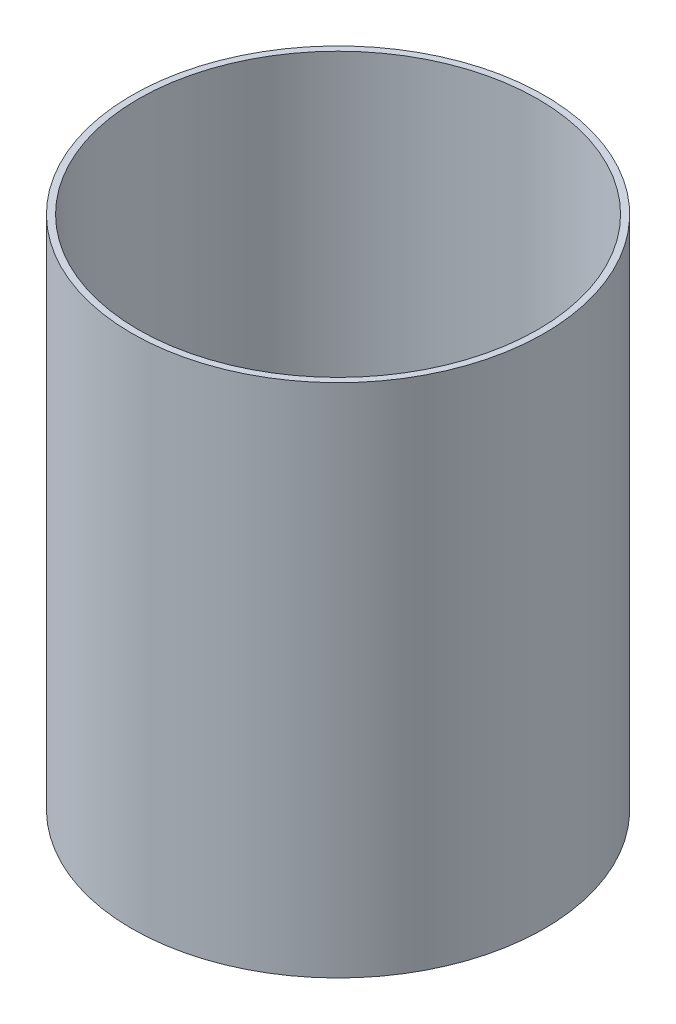
ISO-10303-21;
HEADER;
FILE_DESCRIPTION(('STEP AP214'),'2;1');
FILE_NAME('part.step','',(''),(''),'','','');
FILE_SCHEMA(('AUTOMOTIVE_DESIGN { 1 0 10303 214 1 1 1 1 }'));
ENDSEC;
DATA;
#1=APPLICATION_CONTEXT('core data for automotive mechanical design processes');
#2=APPLICATION_PROTOCOL_DEFINITION('international standard','automotive_design',2000,#1);
#3=PRODUCT_CONTEXT('',#1,'mechanical');
#4=PRODUCT('Part','Part','',(#3));
#5=PRODUCT_RELATED_PRODUCT_CATEGORY('part','',(#4));
#6=PRODUCT_DEFINITION_FORMATION('','',#4);
#7=PRODUCT_DEFINITION_CONTEXT('part definition',#1,'design');
#8=PRODUCT_DEFINITION('design','',#6,#7);
#9=PRODUCT_DEFINITION_SHAPE('','',#8);
#10=(LENGTH_UNIT() NAMED_UNIT(*) SI_UNIT(.MILLI.,.METRE.));
#11=(NAMED_UNIT(*) PLANE_ANGLE_UNIT() SI_UNIT($,.RADIAN.));
#12=(NAMED_UNIT(*) SI_UNIT($,.STERADIAN.) SOLID_ANGLE_UNIT());
#13=UNCERTAINTY_MEASURE_WITH_UNIT(LENGTH_MEASURE(1.E-05),#10,'distance_accuracy_value','');
#14=(GEOMETRIC_REPRESENTATION_CONTEXT(3) GLOBAL_UNCERTAINTY_ASSIGNED_CONTEXT((#13)) GLOBAL_UNIT_ASSIGNED_CONTEXT((#10,
#11,#12)) REPRESENTATION_CONTEXT('',''));
#15=CARTESIAN_POINT('',(0.,0.,0.));
#16=DIRECTION('',(0.,0.,1.));
#17=DIRECTION('',(1.,0.,0.));
#18=AXIS2_PLACEMENT_3D('',#15,#16,#17);
#19=CARTESIAN_POINT('',(0.,127.,0.));
#20=DIRECTION('',(0.,1.,0.));
#21=DIRECTION('',(0.,0.,1.));
#22=AXIS2_PLACEMENT_3D('',#19,#20,#21);
#23=PLANE('',#22);
#24=CARTESIAN_POINT('',(0.,127.,0.));
#25=DIRECTION('',(0.,1.,0.));
#26=DIRECTION('',(0.,0.,1.));
#27=AXIS2_PLACEMENT_3D('',#24,#25,#26);
#28=CIRCLE('',#27,101.6);
#29=CARTESIAN_POINT('',(0.,127.,101.6));
#30=VERTEX_POINT('',#29);
#31=EDGE_CURVE('E12',#30,#30,#28,.T.);
#32=ORIENTED_EDGE('',*,*,#31,.T.);
#33=EDGE_LOOP('',(#32));
#34=FACE_BOUND('',#33,.T.);
#35=CARTESIAN_POINT('',(0.,127.,0.));
#36=DIRECTION('',(0.,1.,0.));
#37=DIRECTION('',(0.,0.,1.));
#38=AXIS2_PLACEMENT_3D('',#35,#36,#37);
#39=CIRCLE('',#38,98.425);
#40=CARTESIAN_POINT('',(0.,127.,98.425));
#41=VERTEX_POINT('',#40);
#42=EDGE_CURVE('E62',#41,#41,#39,.T.);
#43=ORIENTED_EDGE('',*,*,#42,.F.);
#44=EDGE_LOOP('',(#43));
#45=FACE_BOUND('',#44,.T.);
#46=ADVANCED_FACE('F48',(#34,#45),#23,.T.);
#47=CARTESIAN_POINT('',(0.,-127.,0.));
#48=DIRECTION('',(0.,1.,0.));
#49=DIRECTION('',(0.,0.,1.));
#50=AXIS2_PLACEMENT_3D('',#47,#48,#49);
#51=PLANE('',#50);
#52=CARTESIAN_POINT('',(0.,-127.,0.));
#53=DIRECTION('',(0.,1.,0.));
#54=DIRECTION('',(0.,0.,1.));
#55=AXIS2_PLACEMENT_3D('',#52,#53,#54);
#56=CIRCLE('',#55,101.6);
#57=CARTESIAN_POINT('',(0.,-127.,101.6));
#58=VERTEX_POINT('',#57);
#59=EDGE_CURVE('E52',#58,#58,#56,.T.);
#60=ORIENTED_EDGE('',*,*,#59,.F.);
#61=EDGE_LOOP('',(#60));
#62=FACE_BOUND('',#61,.T.);
#63=CARTESIAN_POINT('',(0.,-127.,0.));
#64=DIRECTION('',(0.,1.,0.));
#65=DIRECTION('',(0.,0.,1.));
#66=AXIS2_PLACEMENT_3D('',#63,#64,#65);
#67=CIRCLE('',#66,98.425);
#68=CARTESIAN_POINT('',(0.,-127.,98.425));
#69=VERTEX_POINT('',#68);
#70=EDGE_CURVE('E64',#69,#69,#67,.T.);
#71=ORIENTED_EDGE('',*,*,#70,.T.);
#72=EDGE_LOOP('',(#71));
#73=FACE_BOUND('',#72,.T.);
#74=ADVANCED_FACE('F75',(#62,#73),#51,.F.);
#75=CARTESIAN_POINT('',(0.,127.,0.));
#76=DIRECTION('',(0.,-1.,0.));
#77=DIRECTION('',(0.,0.,-1.));
#78=AXIS2_PLACEMENT_3D('',#75,#76,#77);
#79=CYLINDRICAL_SURFACE('',#78,101.6);
#80=ORIENTED_EDGE('',*,*,#31,.F.);
#81=EDGE_LOOP('',(#80));
#82=FACE_BOUND('',#81,.T.);
#83=ORIENTED_EDGE('',*,*,#59,.T.);
#84=EDGE_LOOP('',(#83));
#85=FACE_BOUND('',#84,.T.);
#86=ADVANCED_FACE('F50',(#82,#85),#79,.T.);
#87=CARTESIAN_POINT('',(0.,127.,0.));
#88=DIRECTION('',(0.,-1.,0.));
#89=DIRECTION('',(0.,0.,-1.));
#90=AXIS2_PLACEMENT_3D('',#87,#88,#89);
#91=CYLINDRICAL_SURFACE('',#90,98.425);
#92=ORIENTED_EDGE('',*,*,#42,.T.);
#93=EDGE_LOOP('',(#92));
#94=FACE_BOUND('',#93,.T.);
#95=ORIENTED_EDGE('',*,*,#70,.F.);
#96=EDGE_LOOP('',(#95));
#97=FACE_BOUND('',#96,.T.);
#98=ADVANCED_FACE('F71',(#94,#97),#91,.F.);
#99=CLOSED_SHELL('',(#46,#74,#86,#98));
#100=MANIFOLD_SOLID_BREP('B2',#99);
#101=ADVANCED_BREP_SHAPE_REPRESENTATION('',(#18,#100),#14);
#102=SHAPE_DEFINITION_REPRESENTATION(#9,#101);
ENDSEC;
END-ISO-10303-21;
